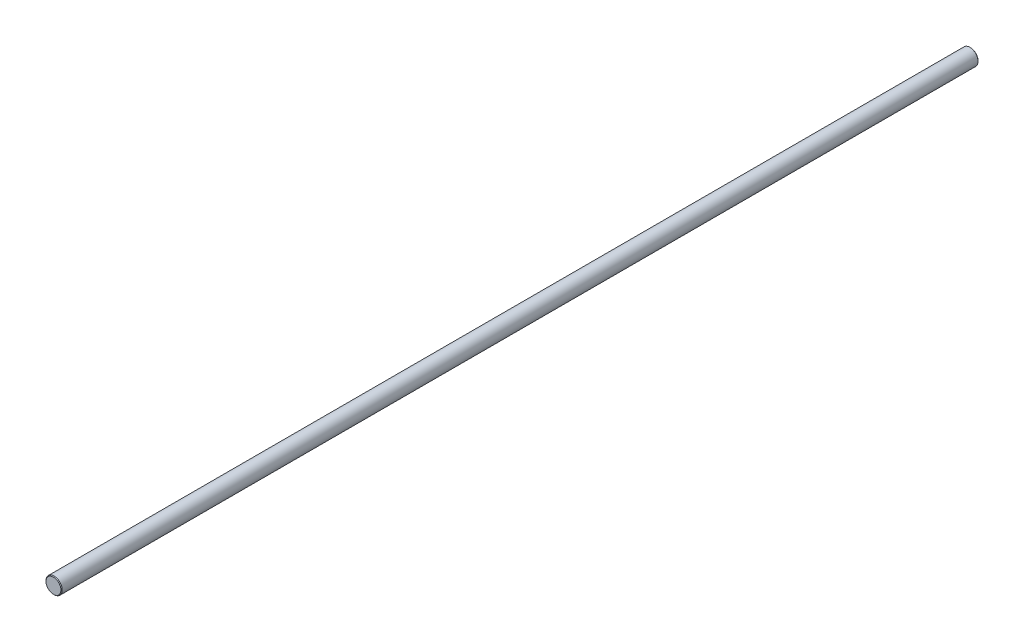
ISO-10303-21;
HEADER;
FILE_DESCRIPTION(('STEP AP214'),'2;1');
FILE_NAME('part.step','',(''),(''),'','','');
FILE_SCHEMA(('AUTOMOTIVE_DESIGN { 1 0 10303 214 1 1 1 1 }'));
ENDSEC;
DATA;
#1=APPLICATION_CONTEXT('core data for automotive mechanical design processes');
#2=APPLICATION_PROTOCOL_DEFINITION('international standard','automotive_design',2000,#1);
#3=PRODUCT_CONTEXT('',#1,'mechanical');
#4=PRODUCT('Part','Part','',(#3));
#5=PRODUCT_RELATED_PRODUCT_CATEGORY('part','',(#4));
#6=PRODUCT_DEFINITION_FORMATION('','',#4);
#7=PRODUCT_DEFINITION_CONTEXT('part definition',#1,'design');
#8=PRODUCT_DEFINITION('design','',#6,#7);
#9=PRODUCT_DEFINITION_SHAPE('','',#8);
#10=(LENGTH_UNIT() NAMED_UNIT(*) SI_UNIT(.MILLI.,.METRE.));
#11=(NAMED_UNIT(*) PLANE_ANGLE_UNIT() SI_UNIT($,.RADIAN.));
#12=(NAMED_UNIT(*) SI_UNIT($,.STERADIAN.) SOLID_ANGLE_UNIT());
#13=UNCERTAINTY_MEASURE_WITH_UNIT(LENGTH_MEASURE(1.E-05),#10,'distance_accuracy_value','');
#14=(GEOMETRIC_REPRESENTATION_CONTEXT(3) GLOBAL_UNCERTAINTY_ASSIGNED_CONTEXT((#13)) GLOBAL_UNIT_ASSIGNED_CONTEXT((#10,
#11,#12)) REPRESENTATION_CONTEXT('',''));
#15=CARTESIAN_POINT('',(0.,0.,0.));
#16=DIRECTION('',(0.,0.,1.));
#17=DIRECTION('',(1.,0.,0.));
#18=AXIS2_PLACEMENT_3D('',#15,#16,#17);
#19=CARTESIAN_POINT('',(0.,0.,707.));
#20=DIRECTION('',(0.,0.,-1.));
#21=DIRECTION('',(-1.,0.,0.));
#22=AXIS2_PLACEMENT_3D('',#19,#20,#21);
#23=CYLINDRICAL_SURFACE('',#22,12.5);
#24=CARTESIAN_POINT('',(0.,0.,-705.999999999999));
#25=DIRECTION('',(0.,0.,1.));
#26=DIRECTION('',(1.,0.,0.));
#27=AXIS2_PLACEMENT_3D('',#24,#25,#26);
#28=CIRCLE('',#27,12.5);
#29=CARTESIAN_POINT('',(-12.5,0.,-705.999999999999));
#30=VERTEX_POINT('',#29);
#31=EDGE_CURVE('E43',#30,#30,#28,.T.);
#32=CARTESIAN_POINT('',(0.,0.,706.000000000001));
#33=DIRECTION('',(0.,0.,1.));
#34=DIRECTION('',(1.,0.,0.));
#35=AXIS2_PLACEMENT_3D('',#32,#33,#34);
#36=CIRCLE('',#35,12.5);
#37=CARTESIAN_POINT('',(-12.5,0.,706.000000000001));
#38=VERTEX_POINT('',#37);
#39=EDGE_CURVE('E47',#38,#38,#36,.F.);
#40=CARTESIAN_POINT('',(-12.5,0.,-705.999999999999));
#41=CARTESIAN_POINT('',(-12.5,0.,-691.291666666665));
#42=CARTESIAN_POINT('',(-12.5,0.,-676.583333333332));
#43=CARTESIAN_POINT('',(-12.5,0.,-647.166666666665));
#44=CARTESIAN_POINT('',(-12.5,0.,-632.458333333332));
#45=CARTESIAN_POINT('',(-12.5,0.,-603.041666666665));
#46=CARTESIAN_POINT('',(-12.5,0.,-588.333333333332));
#47=CARTESIAN_POINT('',(-12.5,0.,-558.916666666665));
#48=CARTESIAN_POINT('',(-12.5,0.,-544.208333333332));
#49=CARTESIAN_POINT('',(-12.5,0.,-514.791666666665));
#50=CARTESIAN_POINT('',(-12.5,0.,-500.083333333332));
#51=CARTESIAN_POINT('',(-12.5,0.,-470.666666666665));
#52=CARTESIAN_POINT('',(-12.5,0.,-455.958333333332));
#53=CARTESIAN_POINT('',(-12.5,0.,-426.541666666666));
#54=CARTESIAN_POINT('',(-12.5,0.,-411.833333333332));
#55=CARTESIAN_POINT('',(-12.5,0.,-382.416666666665));
#56=CARTESIAN_POINT('',(-12.5,0.,-367.708333333332));
#57=CARTESIAN_POINT('',(-12.5,0.,-338.291666666665));
#58=CARTESIAN_POINT('',(-12.5,0.,-323.583333333332));
#59=CARTESIAN_POINT('',(-12.5,0.,-294.166666666666));
#60=CARTESIAN_POINT('',(-12.5,0.,-279.458333333332));
#61=CARTESIAN_POINT('',(-12.5,0.,-250.041666666666));
#62=CARTESIAN_POINT('',(-12.5,0.,-235.333333333332));
#63=CARTESIAN_POINT('',(-12.5,0.,-205.916666666666));
#64=CARTESIAN_POINT('',(-12.5,0.,-191.208333333332));
#65=CARTESIAN_POINT('',(-12.5,0.,-161.791666666666));
#66=CARTESIAN_POINT('',(-12.5,0.,-147.083333333332));
#67=CARTESIAN_POINT('',(-12.5,0.,-117.666666666666));
#68=CARTESIAN_POINT('',(-12.5,0.,-102.958333333332));
#69=CARTESIAN_POINT('',(-12.5,0.,-73.5416666666656));
#70=CARTESIAN_POINT('',(-12.5,0.,-58.8333333333323));
#71=CARTESIAN_POINT('',(-12.5,0.,-29.4166666666656));
#72=CARTESIAN_POINT('',(-12.5,0.,-14.7083333333323));
#73=CARTESIAN_POINT('',(-12.5,0.,14.7083333333343));
#74=CARTESIAN_POINT('',(-12.5,0.,29.4166666666676));
#75=CARTESIAN_POINT('',(-12.5,0.,58.8333333333343));
#76=CARTESIAN_POINT('',(-12.5,0.,73.5416666666676));
#77=CARTESIAN_POINT('',(-12.5,0.,102.958333333334));
#78=CARTESIAN_POINT('',(-12.5,0.,117.666666666668));
#79=CARTESIAN_POINT('',(-12.5,0.,147.083333333334));
#80=CARTESIAN_POINT('',(-12.5,0.,161.791666666668));
#81=CARTESIAN_POINT('',(-12.5,0.,191.208333333334));
#82=CARTESIAN_POINT('',(-12.5,0.,205.916666666668));
#83=CARTESIAN_POINT('',(-12.5,0.,235.333333333334));
#84=CARTESIAN_POINT('',(-12.5,0.,250.041666666668));
#85=CARTESIAN_POINT('',(-12.5,0.,279.458333333334));
#86=CARTESIAN_POINT('',(-12.5,0.,294.166666666668));
#87=CARTESIAN_POINT('',(-12.5,0.,323.583333333334));
#88=CARTESIAN_POINT('',(-12.5,0.,338.291666666667));
#89=CARTESIAN_POINT('',(-12.5,0.,367.708333333334));
#90=CARTESIAN_POINT('',(-12.5,0.,382.416666666667));
#91=CARTESIAN_POINT('',(-12.5,0.,411.833333333334));
#92=CARTESIAN_POINT('',(-12.5,0.,426.541666666667));
#93=CARTESIAN_POINT('',(-12.5,0.,455.958333333334));
#94=CARTESIAN_POINT('',(-12.5,0.,470.666666666668));
#95=CARTESIAN_POINT('',(-12.5,0.,500.083333333334));
#96=CARTESIAN_POINT('',(-12.5,0.,514.791666666668));
#97=CARTESIAN_POINT('',(-12.5,0.,544.208333333334));
#98=CARTESIAN_POINT('',(-12.5,0.,558.916666666668));
#99=CARTESIAN_POINT('',(-12.5,0.,588.333333333334));
#100=CARTESIAN_POINT('',(-12.5,0.,603.041666666667));
#101=CARTESIAN_POINT('',(-12.5,0.,632.458333333334));
#102=CARTESIAN_POINT('',(-12.5,0.,647.166666666667));
#103=CARTESIAN_POINT('',(-12.5,0.,676.583333333334));
#104=CARTESIAN_POINT('',(-12.5,0.,691.291666666667));
#105=CARTESIAN_POINT('',(-12.5,0.,706.000000000001));
#106=B_SPLINE_CURVE_WITH_KNOTS('',3,(#40,#41,#42,#43,#44,#45,#46,#47,#48,#49,#50,#51,#52,#53,
#54,#55,#56,#57,#58,#59,#60,#61,#62,#63,#64,#65,#66,#67,#68,#69,#70,#71,#72,#73,#74,#75,#76,#77,
#78,#79,#80,#81,#82,#83,#84,#85,#86,#87,#88,#89,#90,#91,#92,#93,#94,#95,#96,#97,#98,#99,#100,
#101,#102,#103,#104,#105),.UNSPECIFIED.,.F.,.F.,(4,2,2,2,2,2,2,2,2,2,2,2,2,2,2,2,2,2,2,2,2,2,2,
2,2,2,2,2,2,2,2,2,4),(0.,44.125,88.2499999999999,132.375,176.5,220.625,264.75,308.875,353.,
397.125,441.25,485.375,529.5,573.625,617.75,661.875,706.,750.125,794.25,838.375,882.5,926.625,
970.75,1014.875,1059.,1103.125,1147.25,1191.375,1235.5,1279.625,1323.75,1367.875,1412.),.UNSPECIFIED.);
#107=EDGE_CURVE('BSEAM32',#30,#38,#106,.T.);
#108=ORIENTED_EDGE('',*,*,#31,.T.);
#109=ORIENTED_EDGE('',*,*,#39,.T.);
#110=ORIENTED_EDGE('',*,*,#107,.T.);
#111=ORIENTED_EDGE('',*,*,#107,.F.);
#112=EDGE_LOOP('',(#108,#110,#109,#111));
#113=FACE_BOUND('',#112,.T.);
#114=ADVANCED_FACE('F32',(#113),#23,.T.);
#115=CARTESIAN_POINT('',(0.,0.,707.));
#116=DIRECTION('',(0.,0.,1.));
#117=DIRECTION('',(1.,0.,0.));
#118=AXIS2_PLACEMENT_3D('',#115,#116,#117);
#119=PLANE('',#118);
#120=CARTESIAN_POINT('',(0.,0.,707.));
#121=DIRECTION('',(0.,0.,1.));
#122=DIRECTION('',(1.,0.,0.));
#123=AXIS2_PLACEMENT_3D('',#120,#121,#122);
#124=CIRCLE('',#123,11.500000000001);
#125=CARTESIAN_POINT('',(11.500000000001,0.,707.));
#126=VERTEX_POINT('',#125);
#127=EDGE_CURVE('E10',#126,#126,#124,.T.);
#128=ORIENTED_EDGE('',*,*,#127,.T.);
#129=EDGE_LOOP('',(#128));
#130=FACE_BOUND('',#129,.T.);
#131=ADVANCED_FACE('F63',(#130),#119,.T.);
#132=CARTESIAN_POINT('',(0.,0.,-707.));
#133=DIRECTION('',(0.,0.,1.));
#134=DIRECTION('',(1.,0.,0.));
#135=AXIS2_PLACEMENT_3D('',#132,#133,#134);
#136=PLANE('',#135);
#137=CARTESIAN_POINT('',(0.,0.,-707.));
#138=DIRECTION('',(0.,0.,1.));
#139=DIRECTION('',(1.,0.,0.));
#140=AXIS2_PLACEMENT_3D('',#137,#138,#139);
#141=CIRCLE('',#140,11.499999999999);
#142=CARTESIAN_POINT('',(11.499999999999,0.,-707.));
#143=VERTEX_POINT('',#142);
#144=EDGE_CURVE('E39',#143,#143,#141,.F.);
#145=ORIENTED_EDGE('',*,*,#144,.T.);
#146=EDGE_LOOP('',(#145));
#147=FACE_BOUND('',#146,.T.);
#148=ADVANCED_FACE('F60',(#147),#136,.F.);
#149=CARTESIAN_POINT('',(0.,0.,-705.999999999999));
#150=DIRECTION('',(0.,0.,1.));
#151=DIRECTION('',(1.,0.,0.));
#152=AXIS2_PLACEMENT_3D('',#149,#150,#151);
#153=CONICAL_SURFACE('',#152,12.5,0.785398163397362);
#154=ORIENTED_EDGE('',*,*,#144,.F.);
#155=EDGE_LOOP('',(#154));
#156=FACE_BOUND('',#155,.T.);
#157=ORIENTED_EDGE('',*,*,#31,.F.);
#158=EDGE_LOOP('',(#157));
#159=FACE_BOUND('',#158,.T.);
#160=ADVANCED_FACE('F56',(#156,#159),#153,.T.);
#161=CARTESIAN_POINT('',(0.,0.,707.));
#162=DIRECTION('',(0.,0.,-1.));
#163=DIRECTION('',(-1.,0.,0.));
#164=AXIS2_PLACEMENT_3D('',#161,#162,#163);
#165=CONICAL_SURFACE('',#164,11.500000000001,0.785398163397417);
#166=ORIENTED_EDGE('',*,*,#39,.F.);
#167=EDGE_LOOP('',(#166));
#168=FACE_BOUND('',#167,.T.);
#169=ORIENTED_EDGE('',*,*,#127,.F.);
#170=EDGE_LOOP('',(#169));
#171=FACE_BOUND('',#170,.T.);
#172=ADVANCED_FACE('F34',(#168,#171),#165,.T.);
#173=CLOSED_SHELL('',(#114,#131,#148,#160,#172));
#174=MANIFOLD_SOLID_BREP('B2',#173);
#175=ADVANCED_BREP_SHAPE_REPRESENTATION('',(#18,#174),#14);
#176=SHAPE_DEFINITION_REPRESENTATION(#9,#175);
ENDSEC;
END-ISO-10303-21;
